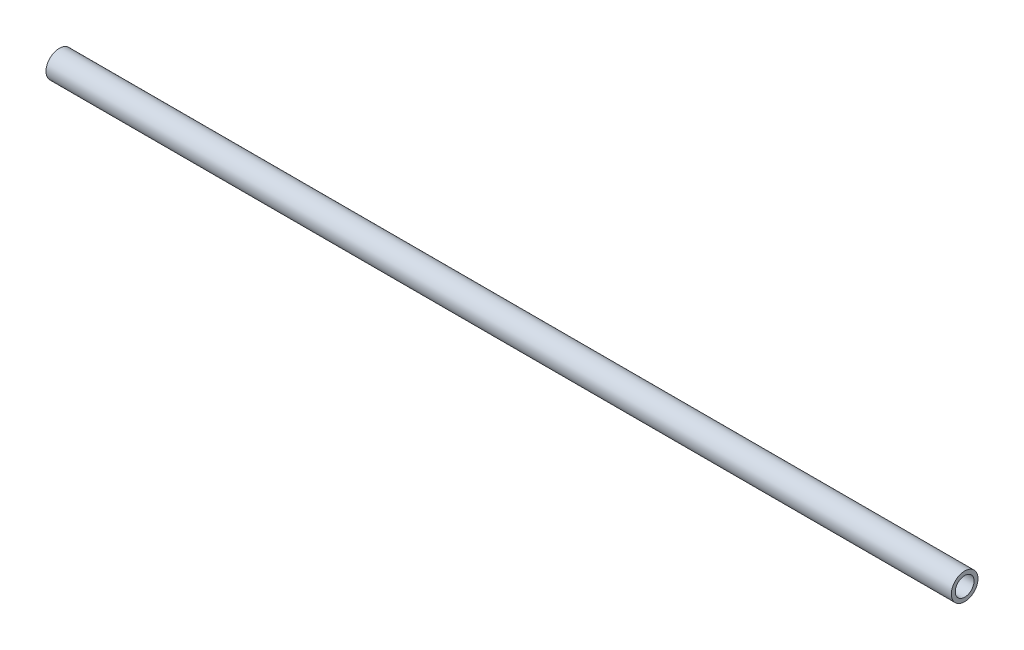
ISO-10303-21;
HEADER;
FILE_DESCRIPTION(('STEP AP214'),'2;1');
FILE_NAME('part.step','',(''),(''),'','','');
FILE_SCHEMA(('AUTOMOTIVE_DESIGN { 1 0 10303 214 1 1 1 1 }'));
ENDSEC;
DATA;
#1=APPLICATION_CONTEXT('core data for automotive mechanical design processes');
#2=APPLICATION_PROTOCOL_DEFINITION('international standard','automotive_design',2000,#1);
#3=PRODUCT_CONTEXT('',#1,'mechanical');
#4=PRODUCT('Part','Part','',(#3));
#5=PRODUCT_RELATED_PRODUCT_CATEGORY('part','',(#4));
#6=PRODUCT_DEFINITION_FORMATION('','',#4);
#7=PRODUCT_DEFINITION_CONTEXT('part definition',#1,'design');
#8=PRODUCT_DEFINITION('design','',#6,#7);
#9=PRODUCT_DEFINITION_SHAPE('','',#8);
#10=(LENGTH_UNIT() NAMED_UNIT(*) SI_UNIT(.MILLI.,.METRE.));
#11=(NAMED_UNIT(*) PLANE_ANGLE_UNIT() SI_UNIT($,.RADIAN.));
#12=(NAMED_UNIT(*) SI_UNIT($,.STERADIAN.) SOLID_ANGLE_UNIT());
#13=UNCERTAINTY_MEASURE_WITH_UNIT(LENGTH_MEASURE(1.E-05),#10,'distance_accuracy_value','');
#14=(GEOMETRIC_REPRESENTATION_CONTEXT(3) GLOBAL_UNCERTAINTY_ASSIGNED_CONTEXT((#13)) GLOBAL_UNIT_ASSIGNED_CONTEXT((#10,
#11,#12)) REPRESENTATION_CONTEXT('',''));
#15=CARTESIAN_POINT('',(0.,0.,0.));
#16=DIRECTION('',(0.,0.,1.));
#17=DIRECTION('',(1.,0.,0.));
#18=AXIS2_PLACEMENT_3D('',#15,#16,#17);
#19=CARTESIAN_POINT('',(-25.4,0.,0.));
#20=DIRECTION('',(1.,0.,0.));
#21=DIRECTION('',(0.,0.,-1.));
#22=AXIS2_PLACEMENT_3D('',#19,#20,#21);
#23=PLANE('',#22);
#24=CARTESIAN_POINT('',(-25.4,0.,0.));
#25=DIRECTION('',(1.,0.,0.));
#26=DIRECTION('',(0.,0.,-1.));
#27=AXIS2_PLACEMENT_3D('',#24,#25,#26);
#28=CIRCLE('',#27,0.455);
#29=CARTESIAN_POINT('',(-25.4,0.,-0.455));
#30=VERTEX_POINT('',#29);
#31=EDGE_CURVE('E18',#30,#30,#28,.T.);
#32=ORIENTED_EDGE('',*,*,#31,.F.);
#33=EDGE_LOOP('',(#32));
#34=FACE_BOUND('',#33,.T.);
#35=CARTESIAN_POINT('',(-25.4,0.,0.));
#36=DIRECTION('',(1.,0.,0.));
#37=DIRECTION('',(0.,0.,-1.));
#38=AXIS2_PLACEMENT_3D('',#35,#36,#37);
#39=CIRCLE('',#38,0.32);
#40=CARTESIAN_POINT('',(-25.4,0.,-0.32));
#41=VERTEX_POINT('',#40);
#42=EDGE_CURVE('E10',#41,#41,#39,.T.);
#43=ORIENTED_EDGE('',*,*,#42,.T.);
#44=EDGE_LOOP('',(#43));
#45=FACE_BOUND('',#44,.T.);
#46=ADVANCED_FACE('F15',(#34,#45),#23,.F.);
#47=CARTESIAN_POINT('',(5.5,0.,0.));
#48=DIRECTION('',(1.,0.,0.));
#49=DIRECTION('',(0.,0.,-1.));
#50=AXIS2_PLACEMENT_3D('',#47,#48,#49);
#51=PLANE('',#50);
#52=CARTESIAN_POINT('',(5.5,0.,0.));
#53=DIRECTION('',(1.,0.,0.));
#54=DIRECTION('',(0.,0.,-1.));
#55=AXIS2_PLACEMENT_3D('',#52,#53,#54);
#56=CIRCLE('',#55,0.455);
#57=CARTESIAN_POINT('',(5.5,0.,-0.455));
#58=VERTEX_POINT('',#57);
#59=EDGE_CURVE('E32',#58,#58,#56,.T.);
#60=ORIENTED_EDGE('',*,*,#59,.T.);
#61=EDGE_LOOP('',(#60));
#62=FACE_BOUND('',#61,.T.);
#63=CARTESIAN_POINT('',(5.5,0.,0.));
#64=DIRECTION('',(1.,0.,0.));
#65=DIRECTION('',(0.,0.,-1.));
#66=AXIS2_PLACEMENT_3D('',#63,#64,#65);
#67=CIRCLE('',#66,0.32);
#68=CARTESIAN_POINT('',(5.5,0.,-0.32));
#69=VERTEX_POINT('',#68);
#70=EDGE_CURVE('E23',#69,#69,#67,.T.);
#71=ORIENTED_EDGE('',*,*,#70,.F.);
#72=EDGE_LOOP('',(#71));
#73=FACE_BOUND('',#72,.T.);
#74=ADVANCED_FACE('F48',(#62,#73),#51,.T.);
#75=CARTESIAN_POINT('',(5.5,0.,0.));
#76=DIRECTION('',(-1.,0.,0.));
#77=DIRECTION('',(0.,0.,1.));
#78=AXIS2_PLACEMENT_3D('',#75,#76,#77);
#79=CYLINDRICAL_SURFACE('',#78,0.32);
#80=ORIENTED_EDGE('',*,*,#42,.F.);
#81=EDGE_LOOP('',(#80));
#82=FACE_BOUND('',#81,.T.);
#83=ORIENTED_EDGE('',*,*,#70,.T.);
#84=EDGE_LOOP('',(#83));
#85=FACE_BOUND('',#84,.T.);
#86=ADVANCED_FACE('F53',(#82,#85),#79,.F.);
#87=CARTESIAN_POINT('',(5.5,0.,0.));
#88=DIRECTION('',(-1.,0.,0.));
#89=DIRECTION('',(0.,0.,1.));
#90=AXIS2_PLACEMENT_3D('',#87,#88,#89);
#91=CYLINDRICAL_SURFACE('',#90,0.455);
#92=ORIENTED_EDGE('',*,*,#31,.T.);
#93=EDGE_LOOP('',(#92));
#94=FACE_BOUND('',#93,.T.);
#95=ORIENTED_EDGE('',*,*,#59,.F.);
#96=EDGE_LOOP('',(#95));
#97=FACE_BOUND('',#96,.T.);
#98=ADVANCED_FACE('F44',(#94,#97),#91,.T.);
#99=CLOSED_SHELL('',(#46,#74,#86,#98));
#100=MANIFOLD_SOLID_BREP('B1',#99);
#101=ADVANCED_BREP_SHAPE_REPRESENTATION('',(#18,#100),#14);
#102=SHAPE_DEFINITION_REPRESENTATION(#9,#101);
ENDSEC;
END-ISO-10303-21;
